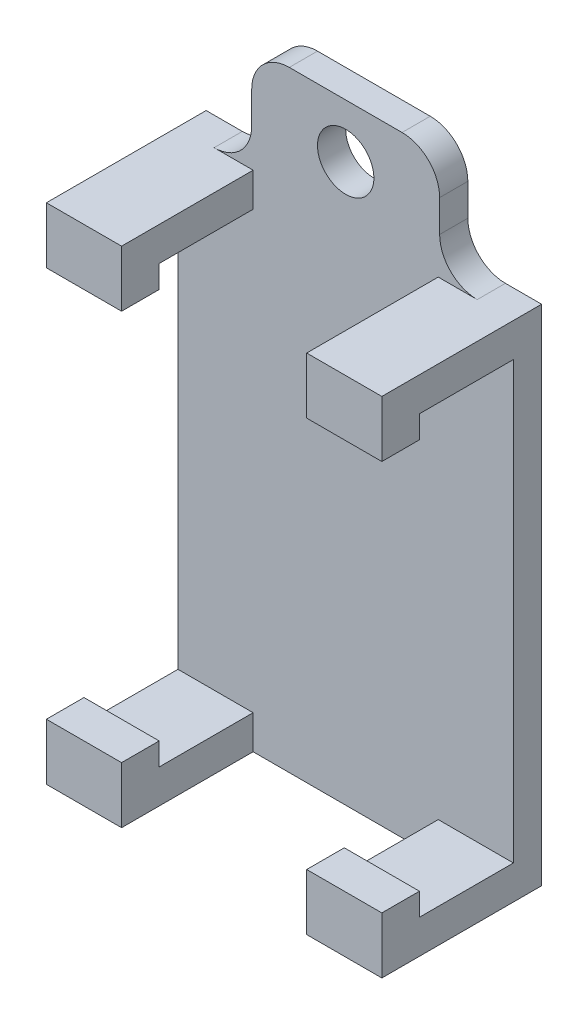
ISO-10303-21;
HEADER;
FILE_DESCRIPTION(('STEP AP214'),'2;1');
FILE_NAME('part.step','',(''),(''),'','','');
FILE_SCHEMA(('AUTOMOTIVE_DESIGN { 1 0 10303 214 1 1 1 1 }'));
ENDSEC;
DATA;
#1=APPLICATION_CONTEXT('core data for automotive mechanical design processes');
#2=APPLICATION_PROTOCOL_DEFINITION('international standard','automotive_design',2000,#1);
#3=PRODUCT_CONTEXT('',#1,'mechanical');
#4=PRODUCT('Part','Part','',(#3));
#5=PRODUCT_RELATED_PRODUCT_CATEGORY('part','',(#4));
#6=PRODUCT_DEFINITION_FORMATION('','',#4);
#7=PRODUCT_DEFINITION_CONTEXT('part definition',#1,'design');
#8=PRODUCT_DEFINITION('design','',#6,#7);
#9=PRODUCT_DEFINITION_SHAPE('','',#8);
#10=(LENGTH_UNIT() NAMED_UNIT(*) SI_UNIT(.MILLI.,.METRE.));
#11=(NAMED_UNIT(*) PLANE_ANGLE_UNIT() SI_UNIT($,.RADIAN.));
#12=(NAMED_UNIT(*) SI_UNIT($,.STERADIAN.) SOLID_ANGLE_UNIT());
#13=UNCERTAINTY_MEASURE_WITH_UNIT(LENGTH_MEASURE(1.E-05),#10,'distance_accuracy_value','');
#14=(GEOMETRIC_REPRESENTATION_CONTEXT(3) GLOBAL_UNCERTAINTY_ASSIGNED_CONTEXT((#13)) GLOBAL_UNIT_ASSIGNED_CONTEXT((#10,
#11,#12)) REPRESENTATION_CONTEXT('',''));
#15=CARTESIAN_POINT('',(0.,0.,0.));
#16=DIRECTION('',(0.,0.,1.));
#17=DIRECTION('',(1.,0.,0.));
#18=AXIS2_PLACEMENT_3D('',#15,#16,#17);
#19=CARTESIAN_POINT('',(0.,11.55,-14.95));
#20=DIRECTION('',(0.,1.,0.));
#21=DIRECTION('',(-1.,0.,0.));
#22=AXIS2_PLACEMENT_3D('',#19,#20,#21);
#23=PLANE('',#22);
#24=DIRECTION('',(-1.,0.,0.));
#25=VECTOR('',#24,1.);
#26=CARTESIAN_POINT('',(0.,11.55,-16.95));
#27=LINE('',#26,#25);
#28=CARTESIAN_POINT('',(4.00000000000001,11.55,-16.95));
#29=VERTEX_POINT('',#28);
#30=CARTESIAN_POINT('',(0.,11.55,-16.95));
#31=VERTEX_POINT('',#30);
#32=EDGE_CURVE('E443',#29,#31,#27,.T.);
#33=ORIENTED_EDGE('',*,*,#32,.F.);
#34=DIRECTION('',(0.,0.,1.));
#35=VECTOR('',#34,1.);
#36=CARTESIAN_POINT('',(4.00000000000001,11.55,-14.95));
#37=LINE('',#36,#35);
#38=CARTESIAN_POINT('',(4.00000000000001,11.55,-14.95));
#39=VERTEX_POINT('',#38);
#40=EDGE_CURVE('E409',#29,#39,#37,.T.);
#41=ORIENTED_EDGE('',*,*,#40,.T.);
#42=DIRECTION('',(1.,0.,0.));
#43=VECTOR('',#42,1.);
#44=CARTESIAN_POINT('',(0.,11.55,-14.95));
#45=LINE('',#44,#43);
#46=CARTESIAN_POINT('',(0.,11.55,-14.95));
#47=VERTEX_POINT('',#46);
#48=EDGE_CURVE('E492',#47,#39,#45,.T.);
#49=ORIENTED_EDGE('',*,*,#48,.F.);
#50=DIRECTION('',(0.,0.,-1.));
#51=VECTOR('',#50,1.);
#52=CARTESIAN_POINT('',(0.,11.55,-14.95));
#53=LINE('',#52,#51);
#54=EDGE_CURVE('E279',#47,#31,#53,.T.);
#55=ORIENTED_EDGE('',*,*,#54,.T.);
#56=EDGE_LOOP('',(#33,#41,#49,#55));
#57=FACE_BOUND('',#56,.T.);
#58=ADVANCED_FACE('F39',(#57),#23,.F.);
#59=CARTESIAN_POINT('',(0.,14.55,-14.95));
#60=DIRECTION('',(0.,-1.,0.));
#61=DIRECTION('',(1.,0.,0.));
#62=AXIS2_PLACEMENT_3D('',#59,#60,#61);
#63=PLANE('',#62);
#64=DIRECTION('',(-1.,0.,0.));
#65=VECTOR('',#64,1.);
#66=CARTESIAN_POINT('',(0.,14.55,-21.95));
#67=LINE('',#66,#65);
#68=CARTESIAN_POINT('',(4.,14.55,-21.95));
#69=VERTEX_POINT('',#68);
#70=CARTESIAN_POINT('',(1.925,14.55,-21.95));
#71=VERTEX_POINT('',#70);
#72=EDGE_CURVE('E489',#69,#71,#67,.T.);
#73=ORIENTED_EDGE('',*,*,#72,.T.);
#74=DIRECTION('',(0.,0.,1.));
#75=VECTOR('',#74,1.);
#76=CARTESIAN_POINT('',(1.925,14.55,-23.45));
#77=LINE('',#76,#75);
#78=CARTESIAN_POINT('',(1.925,14.55,-23.45));
#79=VERTEX_POINT('',#78);
#80=EDGE_CURVE('E266',#71,#79,#77,.F.);
#81=ORIENTED_EDGE('',*,*,#80,.T.);
#82=DIRECTION('',(1.,0.,0.));
#83=VECTOR('',#82,1.);
#84=CARTESIAN_POINT('',(0.,14.55,-23.45));
#85=LINE('',#84,#83);
#86=CARTESIAN_POINT('',(0.,14.55,-23.45));
#87=VERTEX_POINT('',#86);
#88=EDGE_CURVE('E263',#87,#79,#85,.T.);
#89=ORIENTED_EDGE('',*,*,#88,.F.);
#90=DIRECTION('',(0.,0.,-1.));
#91=VECTOR('',#90,1.);
#92=CARTESIAN_POINT('',(0.,14.55,-14.95));
#93=LINE('',#92,#91);
#94=CARTESIAN_POINT('',(0.,14.55,-14.95));
#95=VERTEX_POINT('',#94);
#96=EDGE_CURVE('E247',#95,#87,#93,.T.);
#97=ORIENTED_EDGE('',*,*,#96,.F.);
#98=DIRECTION('',(-1.,0.,0.));
#99=VECTOR('',#98,1.);
#100=CARTESIAN_POINT('',(0.,14.55,-14.95));
#101=LINE('',#100,#99);
#102=CARTESIAN_POINT('',(4.00000000000001,14.55,-14.95));
#103=VERTEX_POINT('',#102);
#104=EDGE_CURVE('E497',#103,#95,#101,.T.);
#105=ORIENTED_EDGE('',*,*,#104,.F.);
#106=DIRECTION('',(0.,0.,-1.));
#107=VECTOR('',#106,1.);
#108=CARTESIAN_POINT('',(4.00000000000001,14.55,-14.95));
#109=LINE('',#108,#107);
#110=EDGE_CURVE('E412',#103,#69,#109,.T.);
#111=ORIENTED_EDGE('',*,*,#110,.T.);
#112=EDGE_LOOP('',(#73,#81,#89,#97,#105,#111));
#113=FACE_BOUND('',#112,.T.);
#114=ADVANCED_FACE('F264',(#113),#63,.F.);
#115=CARTESIAN_POINT('',(0.,-17.95,-14.9500000000001));
#116=DIRECTION('',(0.,0.,-1.));
#117=DIRECTION('',(0.,1.,0.));
#118=AXIS2_PLACEMENT_3D('',#115,#116,#117);
#119=PLANE('',#118);
#120=ORIENTED_EDGE('',*,*,#48,.T.);
#121=DIRECTION('',(0.,-1.,0.));
#122=VECTOR('',#121,1.);
#123=CARTESIAN_POINT('',(4.00000000000001,20.25,-14.9499999999999));
#124=LINE('',#123,#122);
#125=EDGE_CURVE('E370',#103,#39,#124,.T.);
#126=ORIENTED_EDGE('',*,*,#125,.F.);
#127=ORIENTED_EDGE('',*,*,#104,.T.);
#128=DIRECTION('',(0.,-1.,0.));
#129=VECTOR('',#128,1.);
#130=CARTESIAN_POINT('',(0.,11.55,-14.95));
#131=LINE('',#130,#129);
#132=EDGE_CURVE('E256',#95,#47,#131,.T.);
#133=ORIENTED_EDGE('',*,*,#132,.T.);
#134=EDGE_LOOP('',(#120,#126,#127,#133));
#135=FACE_BOUND('',#134,.T.);
#136=ADVANCED_FACE('F538',(#135),#119,.F.);
#137=CARTESIAN_POINT('',(0.,-9.25000000000002,-14.95));
#138=DIRECTION('',(0.,-1.,0.));
#139=DIRECTION('',(1.,0.,0.));
#140=AXIS2_PLACEMENT_3D('',#137,#138,#139);
#141=PLANE('',#140);
#142=DIRECTION('',(-1.,0.,0.));
#143=VECTOR('',#142,1.);
#144=CARTESIAN_POINT('',(0.,-9.25000000000002,-14.95));
#145=LINE('',#144,#143);
#146=CARTESIAN_POINT('',(4.00000000000001,-9.25000000000001,-14.95));
#147=VERTEX_POINT('',#146);
#148=CARTESIAN_POINT('',(0.,-9.25000000000002,-14.95));
#149=VERTEX_POINT('',#148);
#150=EDGE_CURVE('E475',#147,#149,#145,.T.);
#151=ORIENTED_EDGE('',*,*,#150,.F.);
#152=DIRECTION('',(0.,0.,-1.));
#153=VECTOR('',#152,1.);
#154=CARTESIAN_POINT('',(4.00000000000001,-9.25000000000002,-14.95));
#155=LINE('',#154,#153);
#156=CARTESIAN_POINT('',(4.00000000000001,-9.25000000000001,-16.95));
#157=VERTEX_POINT('',#156);
#158=EDGE_CURVE('E400',#147,#157,#155,.T.);
#159=ORIENTED_EDGE('',*,*,#158,.T.);
#160=DIRECTION('',(1.,0.,0.));
#161=VECTOR('',#160,1.);
#162=CARTESIAN_POINT('',(17.85,-9.25000000000001,-16.95));
#163=LINE('',#162,#161);
#164=CARTESIAN_POINT('',(0.,-9.25000000000001,-16.95));
#165=VERTEX_POINT('',#164);
#166=EDGE_CURVE('E427',#165,#157,#163,.T.);
#167=ORIENTED_EDGE('',*,*,#166,.F.);
#168=DIRECTION('',(0.,0.,-1.));
#169=VECTOR('',#168,1.);
#170=CARTESIAN_POINT('',(0.,-9.25000000000002,-14.95));
#171=LINE('',#170,#169);
#172=EDGE_CURVE('E479',#149,#165,#171,.T.);
#173=ORIENTED_EDGE('',*,*,#172,.F.);
#174=EDGE_LOOP('',(#151,#159,#167,#173));
#175=FACE_BOUND('',#174,.T.);
#176=ADVANCED_FACE('F562',(#175),#141,.F.);
#177=CARTESIAN_POINT('',(0.,-17.95,-14.9500000000001));
#178=DIRECTION('',(0.,0.,1.));
#179=DIRECTION('',(0.,-1.,0.));
#180=AXIS2_PLACEMENT_3D('',#177,#178,#179);
#181=PLANE('',#180);
#182=CARTESIAN_POINT('',(4.00000000000001,-12.25,-14.9500000000001));
#183=VERTEX_POINT('',#182);
#184=EDGE_CURVE('E368',#147,#183,#124,.T.);
#185=ORIENTED_EDGE('',*,*,#184,.F.);
#186=ORIENTED_EDGE('',*,*,#150,.T.);
#187=DIRECTION('',(0.,-1.,0.));
#188=VECTOR('',#187,1.);
#189=CARTESIAN_POINT('',(0.,-9.25000000000002,-14.95));
#190=LINE('',#189,#188);
#191=CARTESIAN_POINT('',(0.,-12.25,-14.9500000000001));
#192=VERTEX_POINT('',#191);
#193=EDGE_CURVE('E465',#149,#192,#190,.T.);
#194=ORIENTED_EDGE('',*,*,#193,.T.);
#195=DIRECTION('',(1.,0.,0.));
#196=VECTOR('',#195,1.);
#197=CARTESIAN_POINT('',(0.,-12.25,-14.9500000000001));
#198=LINE('',#197,#196);
#199=EDGE_CURVE('E470',#192,#183,#198,.T.);
#200=ORIENTED_EDGE('',*,*,#199,.T.);
#201=EDGE_LOOP('',(#185,#186,#194,#200));
#202=FACE_BOUND('',#201,.T.);
#203=ADVANCED_FACE('F566',(#202),#181,.T.);
#204=CARTESIAN_POINT('',(0.,12.75,-16.95));
#205=DIRECTION('',(0.,0.,1.));
#206=DIRECTION('',(0.,-1.,0.));
#207=AXIS2_PLACEMENT_3D('',#204,#205,#206);
#208=PLANE('',#207);
#209=DIRECTION('',(-1.,0.,0.));
#210=VECTOR('',#209,1.);
#211=CARTESIAN_POINT('',(0.,12.75,-16.95));
#212=LINE('',#211,#210);
#213=CARTESIAN_POINT('',(4.00000000000001,12.75,-16.95));
#214=VERTEX_POINT('',#213);
#215=CARTESIAN_POINT('',(0.,12.75,-16.95));
#216=VERTEX_POINT('',#215);
#217=EDGE_CURVE('E455',#214,#216,#212,.T.);
#218=ORIENTED_EDGE('',*,*,#217,.F.);
#219=DIRECTION('',(0.,-1.,0.));
#220=VECTOR('',#219,1.);
#221=CARTESIAN_POINT('',(4.00000000000001,12.75,-16.95));
#222=LINE('',#221,#220);
#223=EDGE_CURVE('E406',#214,#29,#222,.T.);
#224=ORIENTED_EDGE('',*,*,#223,.T.);
#225=ORIENTED_EDGE('',*,*,#32,.T.);
#226=DIRECTION('',(0.,-1.,0.));
#227=VECTOR('',#226,1.);
#228=CARTESIAN_POINT('',(0.,12.75,-16.95));
#229=LINE('',#228,#227);
#230=EDGE_CURVE('E462',#216,#31,#229,.T.);
#231=ORIENTED_EDGE('',*,*,#230,.F.);
#232=EDGE_LOOP('',(#218,#224,#225,#231));
#233=FACE_BOUND('',#232,.T.);
#234=ADVANCED_FACE('F543',(#233),#208,.F.);
#235=CARTESIAN_POINT('',(0.,12.75,-23.45));
#236=DIRECTION('',(0.,1.,0.));
#237=DIRECTION('',(-1.,0.,0.));
#238=AXIS2_PLACEMENT_3D('',#235,#236,#237);
#239=PLANE('',#238);
#240=DIRECTION('',(1.,0.,0.));
#241=VECTOR('',#240,1.);
#242=CARTESIAN_POINT('',(0.,12.75,-21.95));
#243=LINE('',#242,#241);
#244=CARTESIAN_POINT('',(0.,12.75,-21.95));
#245=VERTEX_POINT('',#244);
#246=CARTESIAN_POINT('',(4.,12.75,-21.95));
#247=VERTEX_POINT('',#246);
#248=EDGE_CURVE('E450',#245,#247,#243,.T.);
#249=ORIENTED_EDGE('',*,*,#248,.T.);
#250=DIRECTION('',(0.,0.,1.));
#251=VECTOR('',#250,1.);
#252=CARTESIAN_POINT('',(4.,12.75,-23.45));
#253=LINE('',#252,#251);
#254=EDGE_CURVE('E403',#247,#214,#253,.T.);
#255=ORIENTED_EDGE('',*,*,#254,.T.);
#256=ORIENTED_EDGE('',*,*,#217,.T.);
#257=DIRECTION('',(0.,0.,-1.));
#258=VECTOR('',#257,1.);
#259=CARTESIAN_POINT('',(0.,12.75,-21.95));
#260=LINE('',#259,#258);
#261=EDGE_CURVE('E445',#216,#245,#260,.T.);
#262=ORIENTED_EDGE('',*,*,#261,.T.);
#263=EDGE_LOOP('',(#249,#255,#256,#262));
#264=FACE_BOUND('',#263,.T.);
#265=ADVANCED_FACE('F547',(#264),#239,.F.);
#266=CARTESIAN_POINT('',(17.85,-10.45,-16.95));
#267=DIRECTION('',(0.,0.,1.));
#268=DIRECTION('',(0.,-1.,0.));
#269=AXIS2_PLACEMENT_3D('',#266,#267,#268);
#270=PLANE('',#269);
#271=ORIENTED_EDGE('',*,*,#166,.T.);
#272=DIRECTION('',(0.,-1.,0.));
#273=VECTOR('',#272,1.);
#274=CARTESIAN_POINT('',(4.00000000000001,-10.45,-16.95));
#275=LINE('',#274,#273);
#276=CARTESIAN_POINT('',(4.00000000000001,-10.45,-16.95));
#277=VERTEX_POINT('',#276);
#278=EDGE_CURVE('E397',#157,#277,#275,.T.);
#279=ORIENTED_EDGE('',*,*,#278,.T.);
#280=DIRECTION('',(1.,0.,0.));
#281=VECTOR('',#280,1.);
#282=CARTESIAN_POINT('',(17.85,-10.45,-16.95));
#283=LINE('',#282,#281);
#284=CARTESIAN_POINT('',(0.,-10.45,-16.95));
#285=VERTEX_POINT('',#284);
#286=EDGE_CURVE('E434',#285,#277,#283,.T.);
#287=ORIENTED_EDGE('',*,*,#286,.F.);
#288=DIRECTION('',(0.,1.,0.));
#289=VECTOR('',#288,1.);
#290=CARTESIAN_POINT('',(0.,-10.45,-16.95));
#291=LINE('',#290,#289);
#292=EDGE_CURVE('E437',#285,#165,#291,.T.);
#293=ORIENTED_EDGE('',*,*,#292,.T.);
#294=EDGE_LOOP('',(#271,#279,#287,#293));
#295=FACE_BOUND('',#294,.T.);
#296=ADVANCED_FACE('F555',(#295),#270,.F.);
#297=CARTESIAN_POINT('',(0.,-10.45,-23.45));
#298=DIRECTION('',(0.,-1.,0.));
#299=DIRECTION('',(1.,0.,0.));
#300=AXIS2_PLACEMENT_3D('',#297,#298,#299);
#301=PLANE('',#300);
#302=ORIENTED_EDGE('',*,*,#286,.T.);
#303=DIRECTION('',(0.,0.,-1.));
#304=VECTOR('',#303,1.);
#305=CARTESIAN_POINT('',(4.,-10.45,-23.4500000000001));
#306=LINE('',#305,#304);
#307=CARTESIAN_POINT('',(4.,-10.45,-21.95));
#308=VERTEX_POINT('',#307);
#309=EDGE_CURVE('E297',#277,#308,#306,.T.);
#310=ORIENTED_EDGE('',*,*,#309,.T.);
#311=DIRECTION('',(-1.,0.,0.));
#312=VECTOR('',#311,1.);
#313=CARTESIAN_POINT('',(17.85,-10.45,-21.95));
#314=LINE('',#313,#312);
#315=CARTESIAN_POINT('',(0.,-10.45,-21.95));
#316=VERTEX_POINT('',#315);
#317=EDGE_CURVE('E426',#308,#316,#314,.T.);
#318=ORIENTED_EDGE('',*,*,#317,.T.);
#319=DIRECTION('',(0.,0.,1.));
#320=VECTOR('',#319,1.);
#321=CARTESIAN_POINT('',(0.,-10.45,-21.95));
#322=LINE('',#321,#320);
#323=EDGE_CURVE('E431',#316,#285,#322,.T.);
#324=ORIENTED_EDGE('',*,*,#323,.T.);
#325=EDGE_LOOP('',(#302,#310,#318,#324));
#326=FACE_BOUND('',#325,.T.);
#327=ADVANCED_FACE('F553',(#326),#301,.F.);
#328=CARTESIAN_POINT('',(0.,-17.95,-21.9500000000001));
#329=DIRECTION('',(1.,0.,0.));
#330=DIRECTION('',(0.,1.,0.));
#331=AXIS2_PLACEMENT_3D('',#328,#329,#330);
#332=PLANE('',#331);
#333=ORIENTED_EDGE('',*,*,#96,.T.);
#334=DIRECTION('',(0.,-1.,0.));
#335=VECTOR('',#334,1.);
#336=CARTESIAN_POINT('',(0.,-17.95,-23.4500000000001));
#337=LINE('',#336,#335);
#338=CARTESIAN_POINT('',(0.,-12.25,-23.4500000000001));
#339=VERTEX_POINT('',#338);
#340=EDGE_CURVE('E252',#87,#339,#337,.T.);
#341=ORIENTED_EDGE('',*,*,#340,.T.);
#342=DIRECTION('',(0.,0.,-1.));
#343=VECTOR('',#342,1.);
#344=CARTESIAN_POINT('',(0.,-12.25,-14.9500000000001));
#345=LINE('',#344,#343);
#346=EDGE_CURVE('E487',#192,#339,#345,.T.);
#347=ORIENTED_EDGE('',*,*,#346,.F.);
#348=ORIENTED_EDGE('',*,*,#193,.F.);
#349=ORIENTED_EDGE('',*,*,#172,.T.);
#350=ORIENTED_EDGE('',*,*,#292,.F.);
#351=ORIENTED_EDGE('',*,*,#323,.F.);
#352=DIRECTION('',(0.,-1.,0.));
#353=VECTOR('',#352,1.);
#354=CARTESIAN_POINT('',(0.,-17.95,-21.9500000000001));
#355=LINE('',#354,#353);
#356=EDGE_CURVE('E293',#245,#316,#355,.T.);
#357=ORIENTED_EDGE('',*,*,#356,.F.);
#358=ORIENTED_EDGE('',*,*,#261,.F.);
#359=ORIENTED_EDGE('',*,*,#230,.T.);
#360=ORIENTED_EDGE('',*,*,#54,.F.);
#361=ORIENTED_EDGE('',*,*,#132,.F.);
#362=EDGE_LOOP('',(#333,#341,#347,#348,#349,#350,#351,#357,#358,#359,#360,#361));
#363=FACE_BOUND('',#362,.T.);
#364=ADVANCED_FACE('F249',(#363),#332,.F.);
#365=CARTESIAN_POINT('',(17.85,-17.95,-21.9500000000001));
#366=DIRECTION('',(-1.,0.,0.));
#367=DIRECTION('',(0.,-1.,0.));
#368=AXIS2_PLACEMENT_3D('',#365,#366,#367);
#369=PLANE('',#368);
#370=DIRECTION('',(0.,1.,0.));
#371=VECTOR('',#370,1.);
#372=CARTESIAN_POINT('',(17.85,-17.95,-23.4500000000001));
#373=LINE('',#372,#371);
#374=CARTESIAN_POINT('',(17.85,-12.25,-23.4500000000001));
#375=VERTEX_POINT('',#374);
#376=CARTESIAN_POINT('',(17.85,14.55,-23.45));
#377=VERTEX_POINT('',#376);
#378=EDGE_CURVE('E278',#375,#377,#373,.T.);
#379=ORIENTED_EDGE('',*,*,#378,.T.);
#380=DIRECTION('',(0.,0.,-1.));
#381=VECTOR('',#380,1.);
#382=CARTESIAN_POINT('',(17.85,14.55,-14.95));
#383=LINE('',#382,#381);
#384=CARTESIAN_POINT('',(17.85,14.55,-14.95));
#385=VERTEX_POINT('',#384);
#386=EDGE_CURVE('E259',#385,#377,#383,.T.);
#387=ORIENTED_EDGE('',*,*,#386,.F.);
#388=DIRECTION('',(0.,1.,0.));
#389=VECTOR('',#388,1.);
#390=CARTESIAN_POINT('',(17.85,11.55,-14.95));
#391=LINE('',#390,#389);
#392=CARTESIAN_POINT('',(17.85,11.55,-14.95));
#393=VERTEX_POINT('',#392);
#394=EDGE_CURVE('E495',#393,#385,#391,.T.);
#395=ORIENTED_EDGE('',*,*,#394,.F.);
#396=DIRECTION('',(0.,0.,-1.));
#397=VECTOR('',#396,1.);
#398=CARTESIAN_POINT('',(17.85,11.55,-14.95));
#399=LINE('',#398,#397);
#400=CARTESIAN_POINT('',(17.85,11.55,-16.95));
#401=VERTEX_POINT('',#400);
#402=EDGE_CURVE('E285',#393,#401,#399,.T.);
#403=ORIENTED_EDGE('',*,*,#402,.T.);
#404=DIRECTION('',(0.,-1.,0.));
#405=VECTOR('',#404,1.);
#406=CARTESIAN_POINT('',(17.85,12.75,-16.95));
#407=LINE('',#406,#405);
#408=CARTESIAN_POINT('',(17.85,12.75,-16.95));
#409=VERTEX_POINT('',#408);
#410=EDGE_CURVE('E459',#409,#401,#407,.T.);
#411=ORIENTED_EDGE('',*,*,#410,.F.);
#412=DIRECTION('',(0.,0.,1.));
#413=VECTOR('',#412,1.);
#414=CARTESIAN_POINT('',(17.85,12.75,-21.95));
#415=LINE('',#414,#413);
#416=CARTESIAN_POINT('',(17.85,12.75,-21.95));
#417=VERTEX_POINT('',#416);
#418=EDGE_CURVE('E453',#417,#409,#415,.T.);
#419=ORIENTED_EDGE('',*,*,#418,.F.);
#420=DIRECTION('',(0.,1.,0.));
#421=VECTOR('',#420,1.);
#422=CARTESIAN_POINT('',(17.85,-17.95,-21.9500000000001));
#423=LINE('',#422,#421);
#424=CARTESIAN_POINT('',(17.85,-10.45,-21.95));
#425=VERTEX_POINT('',#424);
#426=EDGE_CURVE('E505',#425,#417,#423,.T.);
#427=ORIENTED_EDGE('',*,*,#426,.F.);
#428=DIRECTION('',(0.,0.,-1.));
#429=VECTOR('',#428,1.);
#430=CARTESIAN_POINT('',(17.85,-10.45,-21.95));
#431=LINE('',#430,#429);
#432=CARTESIAN_POINT('',(17.85,-10.45,-16.95));
#433=VERTEX_POINT('',#432);
#434=EDGE_CURVE('E423',#433,#425,#431,.T.);
#435=ORIENTED_EDGE('',*,*,#434,.F.);
#436=DIRECTION('',(0.,1.,0.));
#437=VECTOR('',#436,1.);
#438=CARTESIAN_POINT('',(17.85,-10.45,-16.95));
#439=LINE('',#438,#437);
#440=CARTESIAN_POINT('',(17.85,-9.25000000000001,-16.95));
#441=VERTEX_POINT('',#440);
#442=EDGE_CURVE('E440',#433,#441,#439,.T.);
#443=ORIENTED_EDGE('',*,*,#442,.T.);
#444=DIRECTION('',(0.,0.,-1.));
#445=VECTOR('',#444,1.);
#446=CARTESIAN_POINT('',(17.85,-9.25000000000001,-14.95));
#447=LINE('',#446,#445);
#448=CARTESIAN_POINT('',(17.85,-9.25000000000001,-14.95));
#449=VERTEX_POINT('',#448);
#450=EDGE_CURVE('E482',#449,#441,#447,.T.);
#451=ORIENTED_EDGE('',*,*,#450,.F.);
#452=DIRECTION('',(0.,1.,0.));
#453=VECTOR('',#452,1.);
#454=CARTESIAN_POINT('',(17.85,-9.25000000000001,-14.95));
#455=LINE('',#454,#453);
#456=CARTESIAN_POINT('',(17.85,-12.25,-14.9500000000001));
#457=VERTEX_POINT('',#456);
#458=EDGE_CURVE('E473',#457,#449,#455,.T.);
#459=ORIENTED_EDGE('',*,*,#458,.F.);
#460=DIRECTION('',(0.,0.,-1.));
#461=VECTOR('',#460,1.);
#462=CARTESIAN_POINT('',(17.85,-12.25,-14.9500000000001));
#463=LINE('',#462,#461);
#464=EDGE_CURVE('E485',#457,#375,#463,.T.);
#465=ORIENTED_EDGE('',*,*,#464,.T.);
#466=EDGE_LOOP('',(#379,#387,#395,#403,#411,#419,#427,#435,#443,#451,#459,#465));
#467=FACE_BOUND('',#466,.T.);
#468=ADVANCED_FACE('F582',(#467),#369,.F.);
#469=CARTESIAN_POINT('',(0.,-17.95,-23.4500000000001));
#470=DIRECTION('',(0.,0.,-1.));
#471=DIRECTION('',(0.,1.,0.));
#472=AXIS2_PLACEMENT_3D('',#469,#470,#471);
#473=PLANE('',#472);
#474=DIRECTION('',(0.,1.,0.));
#475=VECTOR('',#474,1.);
#476=CARTESIAN_POINT('',(3.925,20.25,-23.4499999999999));
#477=LINE('',#476,#475);
#478=CARTESIAN_POINT('',(3.925,16.55,-23.45));
#479=VERTEX_POINT('',#478);
#480=CARTESIAN_POINT('',(3.925,18.25,-23.4499999999999));
#481=VERTEX_POINT('',#480);
#482=EDGE_CURVE('E268',#479,#481,#477,.T.);
#483=ORIENTED_EDGE('',*,*,#482,.T.);
#484=CARTESIAN_POINT('',(5.925,18.25,-23.4499999999999));
#485=DIRECTION('',(0.,0.,-1.));
#486=DIRECTION('',(0.,1.,0.));
#487=AXIS2_PLACEMENT_3D('',#484,#485,#486);
#488=CIRCLE('',#487,2.);
#489=CARTESIAN_POINT('',(5.925,20.25,-23.4499999999999));
#490=VERTEX_POINT('',#489);
#491=EDGE_CURVE('E317',#481,#490,#488,.T.);
#492=ORIENTED_EDGE('',*,*,#491,.T.);
#493=DIRECTION('',(-1.,0.,0.));
#494=VECTOR('',#493,1.);
#495=CARTESIAN_POINT('',(0.,20.25,-23.4499999999999));
#496=LINE('',#495,#494);
#497=CARTESIAN_POINT('',(11.925,20.25,-23.4499999999999));
#498=VERTEX_POINT('',#497);
#499=EDGE_CURVE('E282',#498,#490,#496,.T.);
#500=ORIENTED_EDGE('',*,*,#499,.F.);
#501=CARTESIAN_POINT('',(11.925,18.25,-23.4499999999999));
#502=DIRECTION('',(0.,0.,-1.));
#503=DIRECTION('',(0.,1.,0.));
#504=AXIS2_PLACEMENT_3D('',#501,#502,#503);
#505=CIRCLE('',#504,2.);
#506=CARTESIAN_POINT('',(13.925,18.25,-23.4499999999999));
#507=VERTEX_POINT('',#506);
#508=EDGE_CURVE('E315',#498,#507,#505,.T.);
#509=ORIENTED_EDGE('',*,*,#508,.T.);
#510=DIRECTION('',(0.,-1.,0.));
#511=VECTOR('',#510,1.);
#512=CARTESIAN_POINT('',(13.925,20.25,-23.4499999999999));
#513=LINE('',#512,#511);
#514=CARTESIAN_POINT('',(13.925,16.55,-23.45));
#515=VERTEX_POINT('',#514);
#516=EDGE_CURVE('E344',#507,#515,#513,.T.);
#517=ORIENTED_EDGE('',*,*,#516,.T.);
#518=CARTESIAN_POINT('',(15.925,16.55,-23.45));
#519=DIRECTION('',(0.,0.,-1.));
#520=DIRECTION('',(0.,1.,0.));
#521=AXIS2_PLACEMENT_3D('',#518,#519,#520);
#522=CIRCLE('',#521,2.);
#523=CARTESIAN_POINT('',(15.925,14.55,-23.45));
#524=VERTEX_POINT('',#523);
#525=EDGE_CURVE('E12',#515,#524,#522,.F.);
#526=ORIENTED_EDGE('',*,*,#525,.T.);
#527=DIRECTION('',(1.,0.,0.));
#528=VECTOR('',#527,1.);
#529=CARTESIAN_POINT('',(17.85,14.55,-23.45));
#530=LINE('',#529,#528);
#531=EDGE_CURVE('E351',#524,#377,#530,.T.);
#532=ORIENTED_EDGE('',*,*,#531,.T.);
#533=ORIENTED_EDGE('',*,*,#378,.F.);
#534=DIRECTION('',(-1.,0.,0.));
#535=VECTOR('',#534,1.);
#536=CARTESIAN_POINT('',(0.,-12.25,-23.4500000000001));
#537=LINE('',#536,#535);
#538=EDGE_CURVE('E277',#375,#339,#537,.T.);
#539=ORIENTED_EDGE('',*,*,#538,.T.);
#540=ORIENTED_EDGE('',*,*,#340,.F.);
#541=ORIENTED_EDGE('',*,*,#88,.T.);
#542=CARTESIAN_POINT('',(1.925,16.55,-23.45));
#543=DIRECTION('',(0.,0.,-1.));
#544=DIRECTION('',(0.,1.,0.));
#545=AXIS2_PLACEMENT_3D('',#542,#543,#544);
#546=CIRCLE('',#545,2.);
#547=EDGE_CURVE('E330',#79,#479,#546,.F.);
#548=ORIENTED_EDGE('',*,*,#547,.T.);
#549=EDGE_LOOP('',(#483,#492,#500,#509,#517,#526,#532,#533,#539,#540,#541,#548));
#550=FACE_BOUND('',#549,.T.);
#551=CARTESIAN_POINT('',(8.925,17.4,-23.4499999999999));
#552=DIRECTION('',(0.,0.,1.));
#553=DIRECTION('',(0.,-1.,0.));
#554=AXIS2_PLACEMENT_3D('',#551,#552,#553);
#555=CIRCLE('',#554,1.5);
#556=CARTESIAN_POINT('',(8.925,15.9,-23.45));
#557=VERTEX_POINT('',#556);
#558=EDGE_CURVE('E417',#557,#557,#555,.T.);
#559=ORIENTED_EDGE('',*,*,#558,.T.);
#560=EDGE_LOOP('',(#559));
#561=FACE_BOUND('',#560,.T.);
#562=ADVANCED_FACE('F273',(#550,#561),#473,.T.);
#563=CARTESIAN_POINT('',(0.,-17.95,-21.9500000000001));
#564=DIRECTION('',(0.,0.,-1.));
#565=DIRECTION('',(0.,1.,0.));
#566=AXIS2_PLACEMENT_3D('',#563,#564,#565);
#567=PLANE('',#566);
#568=DIRECTION('',(-1.,0.,0.));
#569=VECTOR('',#568,1.);
#570=CARTESIAN_POINT('',(0.,20.25,-21.9499999999999));
#571=LINE('',#570,#569);
#572=CARTESIAN_POINT('',(11.925,20.25,-21.9499999999999));
#573=VERTEX_POINT('',#572);
#574=CARTESIAN_POINT('',(5.925,20.25,-21.9499999999999));
#575=VERTEX_POINT('',#574);
#576=EDGE_CURVE('E288',#573,#575,#571,.T.);
#577=ORIENTED_EDGE('',*,*,#576,.T.);
#578=CARTESIAN_POINT('',(5.925,18.25,-21.9499999999999));
#579=DIRECTION('',(0.,0.,-1.));
#580=DIRECTION('',(0.,1.,0.));
#581=AXIS2_PLACEMENT_3D('',#578,#579,#580);
#582=CIRCLE('',#581,2.);
#583=CARTESIAN_POINT('',(3.925,18.25,-21.9499999999999));
#584=VERTEX_POINT('',#583);
#585=EDGE_CURVE('E313',#575,#584,#582,.F.);
#586=ORIENTED_EDGE('',*,*,#585,.T.);
#587=DIRECTION('',(0.,1.,0.));
#588=VECTOR('',#587,1.);
#589=CARTESIAN_POINT('',(3.925,20.25,-21.9499999999999));
#590=LINE('',#589,#588);
#591=CARTESIAN_POINT('',(3.925,16.55,-21.95));
#592=VERTEX_POINT('',#591);
#593=EDGE_CURVE('E269',#592,#584,#590,.T.);
#594=ORIENTED_EDGE('',*,*,#593,.F.);
#595=CARTESIAN_POINT('',(1.925,16.55,-21.95));
#596=DIRECTION('',(0.,0.,-1.));
#597=DIRECTION('',(0.,1.,0.));
#598=AXIS2_PLACEMENT_3D('',#595,#596,#597);
#599=CIRCLE('',#598,2.);
#600=EDGE_CURVE('E327',#592,#71,#599,.T.);
#601=ORIENTED_EDGE('',*,*,#600,.T.);
#602=ORIENTED_EDGE('',*,*,#72,.F.);
#603=DIRECTION('',(0.,-1.,0.));
#604=VECTOR('',#603,1.);
#605=CARTESIAN_POINT('',(4.,20.25,-21.9499999999999));
#606=LINE('',#605,#604);
#607=EDGE_CURVE('E378',#69,#247,#606,.T.);
#608=ORIENTED_EDGE('',*,*,#607,.T.);
#609=ORIENTED_EDGE('',*,*,#248,.F.);
#610=ORIENTED_EDGE('',*,*,#356,.T.);
#611=ORIENTED_EDGE('',*,*,#317,.F.);
#612=CARTESIAN_POINT('',(4.,-12.25,-21.9500000000001));
#613=VERTEX_POINT('',#612);
#614=EDGE_CURVE('E367',#308,#613,#606,.T.);
#615=ORIENTED_EDGE('',*,*,#614,.T.);
#616=DIRECTION('',(1.,0.,0.));
#617=VECTOR('',#616,1.);
#618=CARTESIAN_POINT('',(4.,-12.25,-21.9500000000001));
#619=LINE('',#618,#617);
#620=CARTESIAN_POINT('',(13.85,-12.25,-21.9500000000001));
#621=VERTEX_POINT('',#620);
#622=EDGE_CURVE('E362',#613,#621,#619,.T.);
#623=ORIENTED_EDGE('',*,*,#622,.T.);
#624=DIRECTION('',(0.,-1.,0.));
#625=VECTOR('',#624,1.);
#626=CARTESIAN_POINT('',(13.85,20.25,-21.9499999999999));
#627=LINE('',#626,#625);
#628=CARTESIAN_POINT('',(13.85,-10.45,-21.95));
#629=VERTEX_POINT('',#628);
#630=EDGE_CURVE('E376',#629,#621,#627,.T.);
#631=ORIENTED_EDGE('',*,*,#630,.F.);
#632=EDGE_CURVE('E428',#425,#629,#314,.T.);
#633=ORIENTED_EDGE('',*,*,#632,.F.);
#634=ORIENTED_EDGE('',*,*,#426,.T.);
#635=CARTESIAN_POINT('',(13.85,12.75,-21.95));
#636=VERTEX_POINT('',#635);
#637=EDGE_CURVE('E448',#636,#417,#243,.T.);
#638=ORIENTED_EDGE('',*,*,#637,.F.);
#639=CARTESIAN_POINT('',(13.85,14.55,-21.95));
#640=VERTEX_POINT('',#639);
#641=EDGE_CURVE('E375',#640,#636,#627,.T.);
#642=ORIENTED_EDGE('',*,*,#641,.F.);
#643=CARTESIAN_POINT('',(15.925,14.55,-21.95));
#644=VERTEX_POINT('',#643);
#645=EDGE_CURVE('E54',#644,#640,#67,.T.);
#646=ORIENTED_EDGE('',*,*,#645,.F.);
#647=CARTESIAN_POINT('',(15.925,16.55,-21.95));
#648=DIRECTION('',(0.,0.,-1.));
#649=DIRECTION('',(0.,1.,0.));
#650=AXIS2_PLACEMENT_3D('',#647,#648,#649);
#651=CIRCLE('',#650,2.);
#652=CARTESIAN_POINT('',(13.925,16.55,-21.95));
#653=VERTEX_POINT('',#652);
#654=EDGE_CURVE('E47',#644,#653,#651,.T.);
#655=ORIENTED_EDGE('',*,*,#654,.T.);
#656=DIRECTION('',(0.,-1.,0.));
#657=VECTOR('',#656,1.);
#658=CARTESIAN_POINT('',(13.925,20.25,-21.9499999999999));
#659=LINE('',#658,#657);
#660=CARTESIAN_POINT('',(13.925,18.25,-21.9499999999999));
#661=VERTEX_POINT('',#660);
#662=EDGE_CURVE('E336',#661,#653,#659,.T.);
#663=ORIENTED_EDGE('',*,*,#662,.F.);
#664=CARTESIAN_POINT('',(11.925,18.25,-21.9499999999999));
#665=DIRECTION('',(0.,0.,-1.));
#666=DIRECTION('',(0.,1.,0.));
#667=AXIS2_PLACEMENT_3D('',#664,#665,#666);
#668=CIRCLE('',#667,2.);
#669=EDGE_CURVE('E311',#661,#573,#668,.F.);
#670=ORIENTED_EDGE('',*,*,#669,.T.);
#671=EDGE_LOOP('',(#577,#586,#594,#601,#602,#608,#609,#610,#611,#615,#623,#631,#633,#634,#638,
#642,#646,#655,#663,#670));
#672=FACE_BOUND('',#671,.T.);
#673=CARTESIAN_POINT('',(8.925,17.4,-21.95));
#674=DIRECTION('',(0.,0.,1.));
#675=DIRECTION('',(0.,-1.,0.));
#676=AXIS2_PLACEMENT_3D('',#673,#674,#675);
#677=CIRCLE('',#676,1.5);
#678=CARTESIAN_POINT('',(8.925,15.9,-21.95));
#679=VERTEX_POINT('',#678);
#680=EDGE_CURVE('E416',#679,#679,#677,.T.);
#681=ORIENTED_EDGE('',*,*,#680,.F.);
#682=EDGE_LOOP('',(#681));
#683=FACE_BOUND('',#682,.T.);
#684=ADVANCED_FACE('F334',(#672,#683),#567,.F.);
#685=CARTESIAN_POINT('',(0.,20.25,-21.9499999999999));
#686=DIRECTION('',(0.,-1.,0.));
#687=DIRECTION('',(1.,0.,0.));
#688=AXIS2_PLACEMENT_3D('',#685,#686,#687);
#689=PLANE('',#688);
#690=ORIENTED_EDGE('',*,*,#499,.T.);
#691=DIRECTION('',(0.,0.,1.));
#692=VECTOR('',#691,1.);
#693=CARTESIAN_POINT('',(5.925,20.25,-21.9499999999999));
#694=LINE('',#693,#692);
#695=EDGE_CURVE('E308',#490,#575,#694,.T.);
#696=ORIENTED_EDGE('',*,*,#695,.T.);
#697=ORIENTED_EDGE('',*,*,#576,.F.);
#698=DIRECTION('',(0.,0.,1.));
#699=VECTOR('',#698,1.);
#700=CARTESIAN_POINT('',(11.925,20.25,-21.9499999999999));
#701=LINE('',#700,#699);
#702=EDGE_CURVE('E306',#573,#498,#701,.F.);
#703=ORIENTED_EDGE('',*,*,#702,.T.);
#704=EDGE_LOOP('',(#690,#696,#697,#703));
#705=FACE_BOUND('',#704,.T.);
#706=ADVANCED_FACE('F514',(#705),#689,.F.);
#707=CARTESIAN_POINT('',(13.85,11.55,-14.95));
#708=VERTEX_POINT('',#707);
#709=EDGE_CURVE('E491',#708,#393,#45,.T.);
#710=ORIENTED_EDGE('',*,*,#709,.F.);
#711=DIRECTION('',(0.,0.,-1.));
#712=VECTOR('',#711,1.);
#713=CARTESIAN_POINT('',(13.85,11.55,-14.95));
#714=LINE('',#713,#712);
#715=CARTESIAN_POINT('',(13.85,11.55,-16.95));
#716=VERTEX_POINT('',#715);
#717=EDGE_CURVE('E392',#708,#716,#714,.T.);
#718=ORIENTED_EDGE('',*,*,#717,.T.);
#719=EDGE_CURVE('E449',#401,#716,#27,.T.);
#720=ORIENTED_EDGE('',*,*,#719,.F.);
#721=ORIENTED_EDGE('',*,*,#402,.F.);
#722=EDGE_LOOP('',(#710,#718,#720,#721));
#723=FACE_BOUND('',#722,.T.);
#724=ADVANCED_FACE('F596',(#723),#23,.F.);
#725=ORIENTED_EDGE('',*,*,#531,.F.);
#726=DIRECTION('',(0.,0.,1.));
#727=VECTOR('',#726,1.);
#728=CARTESIAN_POINT('',(15.925,14.55,-21.95));
#729=LINE('',#728,#727);
#730=EDGE_CURVE('E324',#524,#644,#729,.T.);
#731=ORIENTED_EDGE('',*,*,#730,.T.);
#732=ORIENTED_EDGE('',*,*,#645,.T.);
#733=DIRECTION('',(0.,0.,1.));
#734=VECTOR('',#733,1.);
#735=CARTESIAN_POINT('',(13.85,14.55,-14.95));
#736=LINE('',#735,#734);
#737=CARTESIAN_POINT('',(13.85,14.55,-14.95));
#738=VERTEX_POINT('',#737);
#739=EDGE_CURVE('E395',#640,#738,#736,.T.);
#740=ORIENTED_EDGE('',*,*,#739,.T.);
#741=EDGE_CURVE('E260',#385,#738,#101,.T.);
#742=ORIENTED_EDGE('',*,*,#741,.F.);
#743=ORIENTED_EDGE('',*,*,#386,.T.);
#744=EDGE_LOOP('',(#725,#731,#732,#740,#742,#743));
#745=FACE_BOUND('',#744,.T.);
#746=ADVANCED_FACE('F347',(#745),#63,.F.);
#747=ORIENTED_EDGE('',*,*,#741,.T.);
#748=DIRECTION('',(0.,-1.,0.));
#749=VECTOR('',#748,1.);
#750=CARTESIAN_POINT('',(13.85,20.25,-14.9499999999999));
#751=LINE('',#750,#749);
#752=EDGE_CURVE('E371',#738,#708,#751,.T.);
#753=ORIENTED_EDGE('',*,*,#752,.T.);
#754=ORIENTED_EDGE('',*,*,#709,.T.);
#755=ORIENTED_EDGE('',*,*,#394,.T.);
#756=EDGE_LOOP('',(#747,#753,#754,#755));
#757=FACE_BOUND('',#756,.T.);
#758=ADVANCED_FACE('F600',(#757),#119,.F.);
#759=CARTESIAN_POINT('',(0.,-12.25,-14.9500000000001));
#760=DIRECTION('',(0.,1.,0.));
#761=DIRECTION('',(-1.,0.,0.));
#762=AXIS2_PLACEMENT_3D('',#759,#760,#761);
#763=PLANE('',#762);
#764=ORIENTED_EDGE('',*,*,#622,.F.);
#765=DIRECTION('',(0.,0.,-1.));
#766=VECTOR('',#765,1.);
#767=CARTESIAN_POINT('',(4.00000000000001,-12.25,-14.9500000000001));
#768=LINE('',#767,#766);
#769=EDGE_CURVE('E359',#183,#613,#768,.T.);
#770=ORIENTED_EDGE('',*,*,#769,.F.);
#771=ORIENTED_EDGE('',*,*,#199,.F.);
#772=ORIENTED_EDGE('',*,*,#346,.T.);
#773=ORIENTED_EDGE('',*,*,#538,.F.);
#774=ORIENTED_EDGE('',*,*,#464,.F.);
#775=CARTESIAN_POINT('',(13.85,-12.25,-14.9500000000001));
#776=VERTEX_POINT('',#775);
#777=EDGE_CURVE('E469',#776,#457,#198,.T.);
#778=ORIENTED_EDGE('',*,*,#777,.F.);
#779=DIRECTION('',(0.,0.,1.));
#780=VECTOR('',#779,1.);
#781=CARTESIAN_POINT('',(13.85,-12.25,-14.9500000000001));
#782=LINE('',#781,#780);
#783=EDGE_CURVE('E365',#621,#776,#782,.T.);
#784=ORIENTED_EDGE('',*,*,#783,.F.);
#785=EDGE_LOOP('',(#764,#770,#771,#772,#773,#774,#778,#784));
#786=FACE_BOUND('',#785,.T.);
#787=ADVANCED_FACE('F570',(#786),#763,.F.);
#788=CARTESIAN_POINT('',(13.85,-9.25000000000001,-16.95));
#789=VERTEX_POINT('',#788);
#790=EDGE_CURVE('E420',#789,#441,#163,.T.);
#791=ORIENTED_EDGE('',*,*,#790,.F.);
#792=DIRECTION('',(0.,0.,1.));
#793=VECTOR('',#792,1.);
#794=CARTESIAN_POINT('',(13.85,-9.25000000000001,-14.95));
#795=LINE('',#794,#793);
#796=CARTESIAN_POINT('',(13.85,-9.25000000000001,-14.95));
#797=VERTEX_POINT('',#796);
#798=EDGE_CURVE('E383',#789,#797,#795,.T.);
#799=ORIENTED_EDGE('',*,*,#798,.T.);
#800=EDGE_CURVE('E476',#449,#797,#145,.T.);
#801=ORIENTED_EDGE('',*,*,#800,.F.);
#802=ORIENTED_EDGE('',*,*,#450,.T.);
#803=EDGE_LOOP('',(#791,#799,#801,#802));
#804=FACE_BOUND('',#803,.T.);
#805=ADVANCED_FACE('F608',(#804),#141,.F.);
#806=EDGE_CURVE('E372',#797,#776,#751,.T.);
#807=ORIENTED_EDGE('',*,*,#806,.T.);
#808=ORIENTED_EDGE('',*,*,#777,.T.);
#809=ORIENTED_EDGE('',*,*,#458,.T.);
#810=ORIENTED_EDGE('',*,*,#800,.T.);
#811=EDGE_LOOP('',(#807,#808,#809,#810));
#812=FACE_BOUND('',#811,.T.);
#813=ADVANCED_FACE('F604',(#812),#181,.T.);
#814=ORIENTED_EDGE('',*,*,#719,.T.);
#815=DIRECTION('',(0.,1.,0.));
#816=VECTOR('',#815,1.);
#817=CARTESIAN_POINT('',(13.85,12.75,-16.95));
#818=LINE('',#817,#816);
#819=CARTESIAN_POINT('',(13.85,12.75,-16.95));
#820=VERTEX_POINT('',#819);
#821=EDGE_CURVE('E389',#716,#820,#818,.T.);
#822=ORIENTED_EDGE('',*,*,#821,.T.);
#823=EDGE_CURVE('E456',#409,#820,#212,.T.);
#824=ORIENTED_EDGE('',*,*,#823,.F.);
#825=ORIENTED_EDGE('',*,*,#410,.T.);
#826=EDGE_LOOP('',(#814,#822,#824,#825));
#827=FACE_BOUND('',#826,.T.);
#828=ADVANCED_FACE('F589',(#827),#208,.F.);
#829=ORIENTED_EDGE('',*,*,#823,.T.);
#830=DIRECTION('',(0.,0.,-1.));
#831=VECTOR('',#830,1.);
#832=CARTESIAN_POINT('',(13.85,12.75,-23.45));
#833=LINE('',#832,#831);
#834=EDGE_CURVE('E386',#820,#636,#833,.T.);
#835=ORIENTED_EDGE('',*,*,#834,.T.);
#836=ORIENTED_EDGE('',*,*,#637,.T.);
#837=ORIENTED_EDGE('',*,*,#418,.T.);
#838=EDGE_LOOP('',(#829,#835,#836,#837));
#839=FACE_BOUND('',#838,.T.);
#840=ADVANCED_FACE('F587',(#839),#239,.F.);
#841=CARTESIAN_POINT('',(13.85,-10.45,-16.95));
#842=VERTEX_POINT('',#841);
#843=EDGE_CURVE('E433',#842,#433,#283,.T.);
#844=ORIENTED_EDGE('',*,*,#843,.F.);
#845=DIRECTION('',(0.,1.,0.));
#846=VECTOR('',#845,1.);
#847=CARTESIAN_POINT('',(13.85,-10.45,-16.95));
#848=LINE('',#847,#846);
#849=EDGE_CURVE('E380',#842,#789,#848,.T.);
#850=ORIENTED_EDGE('',*,*,#849,.T.);
#851=ORIENTED_EDGE('',*,*,#790,.T.);
#852=ORIENTED_EDGE('',*,*,#442,.F.);
#853=EDGE_LOOP('',(#844,#850,#851,#852));
#854=FACE_BOUND('',#853,.T.);
#855=ADVANCED_FACE('F610',(#854),#270,.F.);
#856=ORIENTED_EDGE('',*,*,#632,.T.);
#857=DIRECTION('',(0.,0.,1.));
#858=VECTOR('',#857,1.);
#859=CARTESIAN_POINT('',(13.85,-10.45,-23.45));
#860=LINE('',#859,#858);
#861=EDGE_CURVE('E294',#629,#842,#860,.T.);
#862=ORIENTED_EDGE('',*,*,#861,.T.);
#863=ORIENTED_EDGE('',*,*,#843,.T.);
#864=ORIENTED_EDGE('',*,*,#434,.T.);
#865=EDGE_LOOP('',(#856,#862,#863,#864));
#866=FACE_BOUND('',#865,.T.);
#867=ADVANCED_FACE('F578',(#866),#301,.F.);
#868=CARTESIAN_POINT('',(8.925,17.4,-23.4499999999999));
#869=DIRECTION('',(0.,0.,1.));
#870=DIRECTION('',(0.,-1.,0.));
#871=AXIS2_PLACEMENT_3D('',#868,#869,#870);
#872=CYLINDRICAL_SURFACE('',#871,1.5);
#873=ORIENTED_EDGE('',*,*,#558,.F.);
#874=EDGE_LOOP('',(#873));
#875=FACE_BOUND('',#874,.T.);
#876=ORIENTED_EDGE('',*,*,#680,.T.);
#877=EDGE_LOOP('',(#876));
#878=FACE_BOUND('',#877,.T.);
#879=ADVANCED_FACE('F617',(#875,#878),#872,.F.);
#880=CARTESIAN_POINT('',(13.85,20.25,-14.9499999999999));
#881=DIRECTION('',(1.,0.,0.));
#882=DIRECTION('',(0.,0.,1.));
#883=AXIS2_PLACEMENT_3D('',#880,#881,#882);
#884=PLANE('',#883);
#885=ORIENTED_EDGE('',*,*,#849,.F.);
#886=ORIENTED_EDGE('',*,*,#861,.F.);
#887=ORIENTED_EDGE('',*,*,#630,.T.);
#888=ORIENTED_EDGE('',*,*,#783,.T.);
#889=ORIENTED_EDGE('',*,*,#806,.F.);
#890=ORIENTED_EDGE('',*,*,#798,.F.);
#891=EDGE_LOOP('',(#885,#886,#887,#888,#889,#890));
#892=FACE_BOUND('',#891,.T.);
#893=ADVANCED_FACE('F575',(#892),#884,.F.);
#894=CARTESIAN_POINT('',(4.00000000000001,20.25,-14.9499999999999));
#895=DIRECTION('',(-1.,0.,0.));
#896=DIRECTION('',(0.,0.,-1.));
#897=AXIS2_PLACEMENT_3D('',#894,#895,#896);
#898=PLANE('',#897);
#899=ORIENTED_EDGE('',*,*,#184,.T.);
#900=ORIENTED_EDGE('',*,*,#769,.T.);
#901=ORIENTED_EDGE('',*,*,#614,.F.);
#902=ORIENTED_EDGE('',*,*,#309,.F.);
#903=ORIENTED_EDGE('',*,*,#278,.F.);
#904=ORIENTED_EDGE('',*,*,#158,.F.);
#905=EDGE_LOOP('',(#899,#900,#901,#902,#903,#904));
#906=FACE_BOUND('',#905,.T.);
#907=ADVANCED_FACE('F558',(#906),#898,.F.);
#908=ORIENTED_EDGE('',*,*,#125,.T.);
#909=ORIENTED_EDGE('',*,*,#40,.F.);
#910=ORIENTED_EDGE('',*,*,#223,.F.);
#911=ORIENTED_EDGE('',*,*,#254,.F.);
#912=ORIENTED_EDGE('',*,*,#607,.F.);
#913=ORIENTED_EDGE('',*,*,#110,.F.);
#914=EDGE_LOOP('',(#908,#909,#910,#911,#912,#913));
#915=FACE_BOUND('',#914,.T.);
#916=ADVANCED_FACE('F536',(#915),#898,.F.);
#917=ORIENTED_EDGE('',*,*,#641,.T.);
#918=ORIENTED_EDGE('',*,*,#834,.F.);
#919=ORIENTED_EDGE('',*,*,#821,.F.);
#920=ORIENTED_EDGE('',*,*,#717,.F.);
#921=ORIENTED_EDGE('',*,*,#752,.F.);
#922=ORIENTED_EDGE('',*,*,#739,.F.);
#923=EDGE_LOOP('',(#917,#918,#919,#920,#921,#922));
#924=FACE_BOUND('',#923,.T.);
#925=ADVANCED_FACE('F592',(#924),#884,.F.);
#926=CARTESIAN_POINT('',(13.925,20.25,-23.4499999999999));
#927=DIRECTION('',(-1.,0.,0.));
#928=DIRECTION('',(0.,-1.,0.));
#929=AXIS2_PLACEMENT_3D('',#926,#927,#928);
#930=PLANE('',#929);
#931=ORIENTED_EDGE('',*,*,#516,.F.);
#932=DIRECTION('',(0.,0.,1.));
#933=VECTOR('',#932,1.);
#934=CARTESIAN_POINT('',(13.925,18.25,-23.4499999999999));
#935=LINE('',#934,#933);
#936=EDGE_CURVE('E321',#507,#661,#935,.T.);
#937=ORIENTED_EDGE('',*,*,#936,.T.);
#938=ORIENTED_EDGE('',*,*,#662,.T.);
#939=DIRECTION('',(0.,0.,1.));
#940=VECTOR('',#939,1.);
#941=CARTESIAN_POINT('',(13.925,16.55,-23.45));
#942=LINE('',#941,#940);
#943=EDGE_CURVE('E319',#653,#515,#942,.F.);
#944=ORIENTED_EDGE('',*,*,#943,.T.);
#945=EDGE_LOOP('',(#931,#937,#938,#944));
#946=FACE_BOUND('',#945,.T.);
#947=ADVANCED_FACE('F342',(#946),#930,.F.);
#948=CARTESIAN_POINT('',(3.925,20.25,-23.4499999999999));
#949=DIRECTION('',(1.,0.,0.));
#950=DIRECTION('',(0.,1.,0.));
#951=AXIS2_PLACEMENT_3D('',#948,#949,#950);
#952=PLANE('',#951);
#953=ORIENTED_EDGE('',*,*,#482,.F.);
#954=DIRECTION('',(0.,0.,1.));
#955=VECTOR('',#954,1.);
#956=CARTESIAN_POINT('',(3.925,16.55,-21.95));
#957=LINE('',#956,#955);
#958=EDGE_CURVE('E302',#479,#592,#957,.T.);
#959=ORIENTED_EDGE('',*,*,#958,.T.);
#960=ORIENTED_EDGE('',*,*,#593,.T.);
#961=DIRECTION('',(0.,0.,1.));
#962=VECTOR('',#961,1.);
#963=CARTESIAN_POINT('',(3.925,18.25,-23.4499999999999));
#964=LINE('',#963,#962);
#965=EDGE_CURVE('E300',#584,#481,#964,.F.);
#966=ORIENTED_EDGE('',*,*,#965,.T.);
#967=EDGE_LOOP('',(#953,#959,#960,#966));
#968=FACE_BOUND('',#967,.T.);
#969=ADVANCED_FACE('F526',(#968),#952,.F.);
#970=CARTESIAN_POINT('',(1.925,16.55,-23.45));
#971=DIRECTION('',(0.,0.,-1.));
#972=DIRECTION('',(0.,1.,0.));
#973=AXIS2_PLACEMENT_3D('',#970,#971,#972);
#974=CYLINDRICAL_SURFACE('',#973,2.);
#975=ORIENTED_EDGE('',*,*,#547,.F.);
#976=ORIENTED_EDGE('',*,*,#80,.F.);
#977=ORIENTED_EDGE('',*,*,#600,.F.);
#978=ORIENTED_EDGE('',*,*,#958,.F.);
#979=EDGE_LOOP('',(#975,#976,#977,#978));
#980=FACE_BOUND('',#979,.T.);
#981=ADVANCED_FACE('F530',(#980),#974,.F.);
#982=CARTESIAN_POINT('',(5.925,18.25,-21.9499999999999));
#983=DIRECTION('',(0.,0.,1.));
#984=DIRECTION('',(0.,-1.,0.));
#985=AXIS2_PLACEMENT_3D('',#982,#983,#984);
#986=CYLINDRICAL_SURFACE('',#985,2.);
#987=ORIENTED_EDGE('',*,*,#491,.F.);
#988=ORIENTED_EDGE('',*,*,#965,.F.);
#989=ORIENTED_EDGE('',*,*,#585,.F.);
#990=ORIENTED_EDGE('',*,*,#695,.F.);
#991=EDGE_LOOP('',(#987,#988,#989,#990));
#992=FACE_BOUND('',#991,.T.);
#993=ADVANCED_FACE('F522',(#992),#986,.T.);
#994=CARTESIAN_POINT('',(11.925,18.25,-23.4499999999999));
#995=DIRECTION('',(0.,0.,1.));
#996=DIRECTION('',(0.,-1.,0.));
#997=AXIS2_PLACEMENT_3D('',#994,#995,#996);
#998=CYLINDRICAL_SURFACE('',#997,2.);
#999=ORIENTED_EDGE('',*,*,#508,.F.);
#1000=ORIENTED_EDGE('',*,*,#702,.F.);
#1001=ORIENTED_EDGE('',*,*,#669,.F.);
#1002=ORIENTED_EDGE('',*,*,#936,.F.);
#1003=EDGE_LOOP('',(#999,#1000,#1001,#1002));
#1004=FACE_BOUND('',#1003,.T.);
#1005=ADVANCED_FACE('F519',(#1004),#998,.T.);
#1006=CARTESIAN_POINT('',(15.925,16.55,-14.95));
#1007=DIRECTION('',(0.,0.,-1.));
#1008=DIRECTION('',(0.,1.,0.));
#1009=AXIS2_PLACEMENT_3D('',#1006,#1007,#1008);
#1010=CYLINDRICAL_SURFACE('',#1009,2.);
#1011=ORIENTED_EDGE('',*,*,#525,.F.);
#1012=ORIENTED_EDGE('',*,*,#943,.F.);
#1013=ORIENTED_EDGE('',*,*,#654,.F.);
#1014=ORIENTED_EDGE('',*,*,#730,.F.);
#1015=EDGE_LOOP('',(#1011,#1012,#1013,#1014));
#1016=FACE_BOUND('',#1015,.T.);
#1017=ADVANCED_FACE('F41',(#1016),#1010,.F.);
#1018=CLOSED_SHELL('',(#58,#114,#136,#176,#203,#234,#265,#296,#327,#364,#468,#562,#684,#706,
#724,#746,#758,#787,#805,#813,#828,#840,#855,#867,#879,#893,#907,#916,#925,#947,#969,#981,#993,
#1005,#1017));
#1019=MANIFOLD_SOLID_BREP('B2',#1018);
#1020=ADVANCED_BREP_SHAPE_REPRESENTATION('',(#18,#1019),#14);
#1021=SHAPE_DEFINITION_REPRESENTATION(#9,#1020);
ENDSEC;
END-ISO-10303-21;
